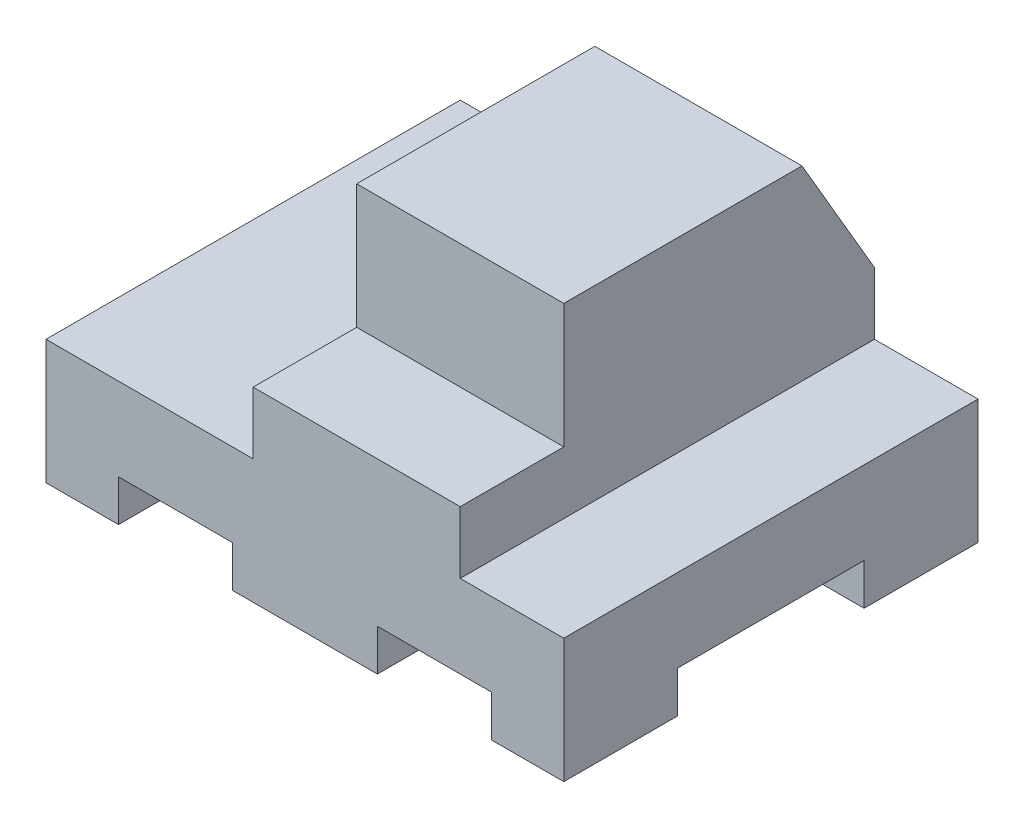
ISO-10303-21;
HEADER;
FILE_DESCRIPTION(('STEP AP214'),'2;1');
FILE_NAME('part.step','',(''),(''),'','','');
FILE_SCHEMA(('AUTOMOTIVE_DESIGN { 1 0 10303 214 1 1 1 1 }'));
ENDSEC;
DATA;
#1=APPLICATION_CONTEXT('core data for automotive mechanical design processes');
#2=APPLICATION_PROTOCOL_DEFINITION('international standard','automotive_design',2000,#1);
#3=PRODUCT_CONTEXT('',#1,'mechanical');
#4=PRODUCT('Part','Part','',(#3));
#5=PRODUCT_RELATED_PRODUCT_CATEGORY('part','',(#4));
#6=PRODUCT_DEFINITION_FORMATION('','',#4);
#7=PRODUCT_DEFINITION_CONTEXT('part definition',#1,'design');
#8=PRODUCT_DEFINITION('design','',#6,#7);
#9=PRODUCT_DEFINITION_SHAPE('','',#8);
#10=(LENGTH_UNIT() NAMED_UNIT(*) SI_UNIT(.MILLI.,.METRE.));
#11=(NAMED_UNIT(*) PLANE_ANGLE_UNIT() SI_UNIT($,.RADIAN.));
#12=(NAMED_UNIT(*) SI_UNIT($,.STERADIAN.) SOLID_ANGLE_UNIT());
#13=UNCERTAINTY_MEASURE_WITH_UNIT(LENGTH_MEASURE(1.E-05),#10,'distance_accuracy_value','');
#14=(GEOMETRIC_REPRESENTATION_CONTEXT(3) GLOBAL_UNCERTAINTY_ASSIGNED_CONTEXT((#13)) GLOBAL_UNIT_ASSIGNED_CONTEXT((#10,
#11,#12)) REPRESENTATION_CONTEXT('',''));
#15=CARTESIAN_POINT('',(0.,0.,0.));
#16=DIRECTION('',(0.,0.,1.));
#17=DIRECTION('',(1.,0.,0.));
#18=AXIS2_PLACEMENT_3D('',#15,#16,#17);
#19=CARTESIAN_POINT('',(0.,0.,40.));
#20=DIRECTION('',(0.,0.,1.));
#21=DIRECTION('',(1.,0.,0.));
#22=AXIS2_PLACEMENT_3D('',#19,#20,#21);
#23=PLANE('',#22);
#24=DIRECTION('',(1.,0.,0.));
#25=VECTOR('',#24,1.);
#26=CARTESIAN_POINT('',(-25.,2.99999999999999,40.));
#27=LINE('',#26,#25);
#28=CARTESIAN_POINT('',(-4.99999999999999,3.,40.));
#29=VERTEX_POINT('',#28);
#30=CARTESIAN_POINT('',(15.,3.,40.));
#31=VERTEX_POINT('',#30);
#32=EDGE_CURVE('E278',#29,#31,#27,.T.);
#33=ORIENTED_EDGE('',*,*,#32,.F.);
#34=DIRECTION('',(0.,1.,0.));
#35=VECTOR('',#34,1.);
#36=CARTESIAN_POINT('',(-4.99999999999999,0.,40.));
#37=LINE('',#36,#35);
#38=CARTESIAN_POINT('',(-4.99999999999999,-3.,40.));
#39=VERTEX_POINT('',#38);
#40=EDGE_CURVE('E275',#39,#29,#37,.T.);
#41=ORIENTED_EDGE('',*,*,#40,.F.);
#42=DIRECTION('',(1.,0.,0.));
#43=VECTOR('',#42,1.);
#44=CARTESIAN_POINT('',(0.,-3.,40.));
#45=LINE('',#44,#43);
#46=CARTESIAN_POINT('',(-25.,-3.,40.));
#47=VERTEX_POINT('',#46);
#48=EDGE_CURVE('E420',#47,#39,#45,.T.);
#49=ORIENTED_EDGE('',*,*,#48,.F.);
#50=DIRECTION('',(0.,1.,0.));
#51=VECTOR('',#50,1.);
#52=CARTESIAN_POINT('',(-25.,0.,40.));
#53=LINE('',#52,#51);
#54=CARTESIAN_POINT('',(-25.,-15.,40.));
#55=VERTEX_POINT('',#54);
#56=EDGE_CURVE('E422',#55,#47,#53,.T.);
#57=ORIENTED_EDGE('',*,*,#56,.F.);
#58=DIRECTION('',(1.,0.,0.));
#59=VECTOR('',#58,1.);
#60=CARTESIAN_POINT('',(0.,-15.,40.));
#61=LINE('',#60,#59);
#62=CARTESIAN_POINT('',(-18.,-15.,40.));
#63=VERTEX_POINT('',#62);
#64=EDGE_CURVE('E426',#55,#63,#61,.T.);
#65=ORIENTED_EDGE('',*,*,#64,.T.);
#66=DIRECTION('',(0.,1.,0.));
#67=VECTOR('',#66,1.);
#68=CARTESIAN_POINT('',(-18.,0.,40.));
#69=LINE('',#68,#67);
#70=CARTESIAN_POINT('',(-18.,-11.,40.));
#71=VERTEX_POINT('',#70);
#72=EDGE_CURVE('E339',#63,#71,#69,.T.);
#73=ORIENTED_EDGE('',*,*,#72,.T.);
#74=DIRECTION('',(1.,0.,0.));
#75=VECTOR('',#74,1.);
#76=CARTESIAN_POINT('',(0.,-11.,40.));
#77=LINE('',#76,#75);
#78=CARTESIAN_POINT('',(-7.,-11.,40.));
#79=VERTEX_POINT('',#78);
#80=EDGE_CURVE('E346',#71,#79,#77,.T.);
#81=ORIENTED_EDGE('',*,*,#80,.T.);
#82=DIRECTION('',(0.,1.,0.));
#83=VECTOR('',#82,1.);
#84=CARTESIAN_POINT('',(-7.,0.,40.));
#85=LINE('',#84,#83);
#86=CARTESIAN_POINT('',(-7.,-15.,40.));
#87=VERTEX_POINT('',#86);
#88=EDGE_CURVE('E334',#87,#79,#85,.T.);
#89=ORIENTED_EDGE('',*,*,#88,.F.);
#90=CARTESIAN_POINT('',(7.,-15.,40.));
#91=VERTEX_POINT('',#90);
#92=EDGE_CURVE('E430',#87,#91,#61,.T.);
#93=ORIENTED_EDGE('',*,*,#92,.T.);
#94=DIRECTION('',(0.,1.,0.));
#95=VECTOR('',#94,1.);
#96=CARTESIAN_POINT('',(7.,0.,40.));
#97=LINE('',#96,#95);
#98=CARTESIAN_POINT('',(7.,-11.,40.));
#99=VERTEX_POINT('',#98);
#100=EDGE_CURVE('E297',#91,#99,#97,.T.);
#101=ORIENTED_EDGE('',*,*,#100,.T.);
#102=DIRECTION('',(-1.,0.,0.));
#103=VECTOR('',#102,1.);
#104=CARTESIAN_POINT('',(0.,-11.,40.));
#105=LINE('',#104,#103);
#106=CARTESIAN_POINT('',(18.,-11.,40.));
#107=VERTEX_POINT('',#106);
#108=EDGE_CURVE('E306',#107,#99,#105,.T.);
#109=ORIENTED_EDGE('',*,*,#108,.F.);
#110=DIRECTION('',(0.,1.,0.));
#111=VECTOR('',#110,1.);
#112=CARTESIAN_POINT('',(18.,0.,40.));
#113=LINE('',#112,#111);
#114=CARTESIAN_POINT('',(18.,-15.,40.));
#115=VERTEX_POINT('',#114);
#116=EDGE_CURVE('E303',#115,#107,#113,.T.);
#117=ORIENTED_EDGE('',*,*,#116,.F.);
#118=CARTESIAN_POINT('',(25.,-15.,40.));
#119=VERTEX_POINT('',#118);
#120=EDGE_CURVE('E425',#115,#119,#61,.T.);
#121=ORIENTED_EDGE('',*,*,#120,.T.);
#122=DIRECTION('',(0.,1.,0.));
#123=VECTOR('',#122,1.);
#124=CARTESIAN_POINT('',(25.,0.,40.));
#125=LINE('',#124,#123);
#126=CARTESIAN_POINT('',(25.,-3.,40.));
#127=VERTEX_POINT('',#126);
#128=EDGE_CURVE('E429',#119,#127,#125,.T.);
#129=ORIENTED_EDGE('',*,*,#128,.T.);
#130=DIRECTION('',(1.,0.,0.));
#131=VECTOR('',#130,1.);
#132=CARTESIAN_POINT('',(0.,-3.,40.));
#133=LINE('',#132,#131);
#134=CARTESIAN_POINT('',(15.,-3.,40.));
#135=VERTEX_POINT('',#134);
#136=EDGE_CURVE('E414',#135,#127,#133,.T.);
#137=ORIENTED_EDGE('',*,*,#136,.F.);
#138=DIRECTION('',(0.,-1.,0.));
#139=VECTOR('',#138,1.);
#140=CARTESIAN_POINT('',(15.,0.,40.));
#141=LINE('',#140,#139);
#142=EDGE_CURVE('E285',#31,#135,#141,.T.);
#143=ORIENTED_EDGE('',*,*,#142,.F.);
#144=EDGE_LOOP('',(#33,#41,#49,#57,#65,#73,#81,#89,#93,#101,#109,#117,#121,#129,#137,#143));
#145=FACE_BOUND('',#144,.T.);
#146=ADVANCED_FACE('F37',(#145),#23,.T.);
#147=CARTESIAN_POINT('',(0.,0.,0.));
#148=DIRECTION('',(0.,0.,1.));
#149=DIRECTION('',(1.,0.,0.));
#150=AXIS2_PLACEMENT_3D('',#147,#148,#149);
#151=PLANE('',#150);
#152=DIRECTION('',(0.,1.,0.));
#153=VECTOR('',#152,1.);
#154=CARTESIAN_POINT('',(-4.99999999999999,0.,0.));
#155=LINE('',#154,#153);
#156=CARTESIAN_POINT('',(-4.99999999999999,-3.,0.));
#157=VERTEX_POINT('',#156);
#158=CARTESIAN_POINT('',(-4.99999999999999,2.99999999999998,0.));
#159=VERTEX_POINT('',#158);
#160=EDGE_CURVE('E436',#157,#159,#155,.T.);
#161=ORIENTED_EDGE('',*,*,#160,.T.);
#162=DIRECTION('',(1.,0.,0.));
#163=VECTOR('',#162,1.);
#164=CARTESIAN_POINT('',(-25.,2.99999999999999,0.));
#165=LINE('',#164,#163);
#166=CARTESIAN_POINT('',(15.,3.,0.));
#167=VERTEX_POINT('',#166);
#168=EDGE_CURVE('E51',#159,#167,#165,.T.);
#169=ORIENTED_EDGE('',*,*,#168,.T.);
#170=DIRECTION('',(0.,-1.,0.));
#171=VECTOR('',#170,1.);
#172=CARTESIAN_POINT('',(15.,0.,0.));
#173=LINE('',#172,#171);
#174=CARTESIAN_POINT('',(15.,-3.,0.));
#175=VERTEX_POINT('',#174);
#176=EDGE_CURVE('E253',#167,#175,#173,.T.);
#177=ORIENTED_EDGE('',*,*,#176,.T.);
#178=DIRECTION('',(1.,0.,0.));
#179=VECTOR('',#178,1.);
#180=CARTESIAN_POINT('',(0.,-3.,0.));
#181=LINE('',#180,#179);
#182=CARTESIAN_POINT('',(25.,-3.,0.));
#183=VERTEX_POINT('',#182);
#184=EDGE_CURVE('E397',#175,#183,#181,.T.);
#185=ORIENTED_EDGE('',*,*,#184,.T.);
#186=DIRECTION('',(0.,1.,0.));
#187=VECTOR('',#186,1.);
#188=CARTESIAN_POINT('',(25.,0.,0.));
#189=LINE('',#188,#187);
#190=CARTESIAN_POINT('',(25.,-15.,0.));
#191=VERTEX_POINT('',#190);
#192=EDGE_CURVE('E417',#191,#183,#189,.T.);
#193=ORIENTED_EDGE('',*,*,#192,.F.);
#194=DIRECTION('',(1.,0.,0.));
#195=VECTOR('',#194,1.);
#196=CARTESIAN_POINT('',(0.,-15.,0.));
#197=LINE('',#196,#195);
#198=CARTESIAN_POINT('',(18.,-15.,0.));
#199=VERTEX_POINT('',#198);
#200=EDGE_CURVE('E445',#199,#191,#197,.T.);
#201=ORIENTED_EDGE('',*,*,#200,.F.);
#202=DIRECTION('',(0.,1.,0.));
#203=VECTOR('',#202,1.);
#204=CARTESIAN_POINT('',(18.,0.,0.));
#205=LINE('',#204,#203);
#206=CARTESIAN_POINT('',(18.,-11.,0.));
#207=VERTEX_POINT('',#206);
#208=EDGE_CURVE('E293',#199,#207,#205,.T.);
#209=ORIENTED_EDGE('',*,*,#208,.T.);
#210=DIRECTION('',(-1.,0.,0.));
#211=VECTOR('',#210,1.);
#212=CARTESIAN_POINT('',(0.,-11.,0.));
#213=LINE('',#212,#211);
#214=CARTESIAN_POINT('',(7.,-11.,0.));
#215=VERTEX_POINT('',#214);
#216=EDGE_CURVE('E296',#207,#215,#213,.T.);
#217=ORIENTED_EDGE('',*,*,#216,.T.);
#218=DIRECTION('',(0.,1.,0.));
#219=VECTOR('',#218,1.);
#220=CARTESIAN_POINT('',(7.,0.,0.));
#221=LINE('',#220,#219);
#222=CARTESIAN_POINT('',(7.,-15.,0.));
#223=VERTEX_POINT('',#222);
#224=EDGE_CURVE('E300',#223,#215,#221,.T.);
#225=ORIENTED_EDGE('',*,*,#224,.F.);
#226=CARTESIAN_POINT('',(-7.,-15.,0.));
#227=VERTEX_POINT('',#226);
#228=EDGE_CURVE('E449',#227,#223,#197,.T.);
#229=ORIENTED_EDGE('',*,*,#228,.F.);
#230=DIRECTION('',(0.,1.,0.));
#231=VECTOR('',#230,1.);
#232=CARTESIAN_POINT('',(-7.,0.,0.));
#233=LINE('',#232,#231);
#234=CARTESIAN_POINT('',(-7.,-11.,0.));
#235=VERTEX_POINT('',#234);
#236=EDGE_CURVE('E335',#227,#235,#233,.T.);
#237=ORIENTED_EDGE('',*,*,#236,.T.);
#238=DIRECTION('',(1.,0.,0.));
#239=VECTOR('',#238,1.);
#240=CARTESIAN_POINT('',(0.,-11.,0.));
#241=LINE('',#240,#239);
#242=CARTESIAN_POINT('',(-18.,-11.,0.));
#243=VERTEX_POINT('',#242);
#244=EDGE_CURVE('E338',#243,#235,#241,.T.);
#245=ORIENTED_EDGE('',*,*,#244,.F.);
#246=DIRECTION('',(0.,1.,0.));
#247=VECTOR('',#246,1.);
#248=CARTESIAN_POINT('',(-18.,0.,0.));
#249=LINE('',#248,#247);
#250=CARTESIAN_POINT('',(-18.,-15.,0.));
#251=VERTEX_POINT('',#250);
#252=EDGE_CURVE('E341',#251,#243,#249,.T.);
#253=ORIENTED_EDGE('',*,*,#252,.F.);
#254=CARTESIAN_POINT('',(-25.,-15.,0.));
#255=VERTEX_POINT('',#254);
#256=EDGE_CURVE('E446',#255,#251,#197,.T.);
#257=ORIENTED_EDGE('',*,*,#256,.F.);
#258=DIRECTION('',(0.,1.,0.));
#259=VECTOR('',#258,1.);
#260=CARTESIAN_POINT('',(-25.,0.,0.));
#261=LINE('',#260,#259);
#262=CARTESIAN_POINT('',(-25.,-3.,0.));
#263=VERTEX_POINT('',#262);
#264=EDGE_CURVE('E442',#255,#263,#261,.T.);
#265=ORIENTED_EDGE('',*,*,#264,.T.);
#266=DIRECTION('',(1.,0.,0.));
#267=VECTOR('',#266,1.);
#268=CARTESIAN_POINT('',(0.,-3.,0.));
#269=LINE('',#268,#267);
#270=EDGE_CURVE('E439',#263,#157,#269,.T.);
#271=ORIENTED_EDGE('',*,*,#270,.T.);
#272=EDGE_LOOP('',(#161,#169,#177,#185,#193,#201,#209,#217,#225,#229,#237,#245,#253,#257,#265,#271));
#273=FACE_BOUND('',#272,.T.);
#274=ADVANCED_FACE('F467',(#273),#151,.F.);
#275=CARTESIAN_POINT('',(0.,-15.,40.));
#276=DIRECTION('',(0.,1.,0.));
#277=DIRECTION('',(0.,0.,1.));
#278=AXIS2_PLACEMENT_3D('',#275,#276,#277);
#279=PLANE('',#278);
#280=DIRECTION('',(0.,0.,1.));
#281=VECTOR('',#280,1.);
#282=CARTESIAN_POINT('',(7.,-15.,0.));
#283=LINE('',#282,#281);
#284=CARTESIAN_POINT('',(7.,-15.,29.));
#285=VERTEX_POINT('',#284);
#286=EDGE_CURVE('E315',#285,#91,#283,.T.);
#287=ORIENTED_EDGE('',*,*,#286,.T.);
#288=ORIENTED_EDGE('',*,*,#92,.F.);
#289=DIRECTION('',(0.,0.,1.));
#290=VECTOR('',#289,1.);
#291=CARTESIAN_POINT('',(-7.,-15.,0.));
#292=LINE('',#291,#290);
#293=CARTESIAN_POINT('',(-7.,-15.,29.));
#294=VERTEX_POINT('',#293);
#295=EDGE_CURVE('E343',#294,#87,#292,.T.);
#296=ORIENTED_EDGE('',*,*,#295,.F.);
#297=DIRECTION('',(-1.,0.,0.));
#298=VECTOR('',#297,1.);
#299=CARTESIAN_POINT('',(25.,-15.,29.));
#300=LINE('',#299,#298);
#301=EDGE_CURVE('E398',#285,#294,#300,.T.);
#302=ORIENTED_EDGE('',*,*,#301,.F.);
#303=EDGE_LOOP('',(#287,#288,#296,#302));
#304=FACE_BOUND('',#303,.T.);
#305=ADVANCED_FACE('F507',(#304),#279,.F.);
#306=CARTESIAN_POINT('',(7.,-15.,11.));
#307=VERTEX_POINT('',#306);
#308=EDGE_CURVE('E311',#223,#307,#283,.T.);
#309=ORIENTED_EDGE('',*,*,#308,.T.);
#310=DIRECTION('',(-1.,0.,0.));
#311=VECTOR('',#310,1.);
#312=CARTESIAN_POINT('',(25.,-15.,11.));
#313=LINE('',#312,#311);
#314=CARTESIAN_POINT('',(-7.,-15.,11.));
#315=VERTEX_POINT('',#314);
#316=EDGE_CURVE('E403',#307,#315,#313,.T.);
#317=ORIENTED_EDGE('',*,*,#316,.T.);
#318=EDGE_CURVE('E363',#227,#315,#292,.T.);
#319=ORIENTED_EDGE('',*,*,#318,.F.);
#320=ORIENTED_EDGE('',*,*,#228,.T.);
#321=EDGE_LOOP('',(#309,#317,#319,#320));
#322=FACE_BOUND('',#321,.T.);
#323=ADVANCED_FACE('F537',(#322),#279,.F.);
#324=CARTESIAN_POINT('',(25.,-15.,29.));
#325=DIRECTION('',(0.,0.,1.));
#326=DIRECTION('',(1.,0.,0.));
#327=AXIS2_PLACEMENT_3D('',#324,#325,#326);
#328=PLANE('',#327);
#329=DIRECTION('',(0.,1.,0.));
#330=VECTOR('',#329,1.);
#331=CARTESIAN_POINT('',(7.,-15.,29.));
#332=LINE('',#331,#330);
#333=CARTESIAN_POINT('',(7.,-11.,29.));
#334=VERTEX_POINT('',#333);
#335=EDGE_CURVE('E332',#285,#334,#332,.T.);
#336=ORIENTED_EDGE('',*,*,#335,.F.);
#337=ORIENTED_EDGE('',*,*,#301,.T.);
#338=DIRECTION('',(0.,1.,0.));
#339=VECTOR('',#338,1.);
#340=CARTESIAN_POINT('',(-7.,-15.,29.));
#341=LINE('',#340,#339);
#342=CARTESIAN_POINT('',(-7.,-11.,29.));
#343=VERTEX_POINT('',#342);
#344=EDGE_CURVE('E368',#294,#343,#341,.T.);
#345=ORIENTED_EDGE('',*,*,#344,.T.);
#346=DIRECTION('',(-1.,0.,0.));
#347=VECTOR('',#346,1.);
#348=CARTESIAN_POINT('',(25.,-11.,29.));
#349=LINE('',#348,#347);
#350=EDGE_CURVE('E413',#334,#343,#349,.T.);
#351=ORIENTED_EDGE('',*,*,#350,.F.);
#352=EDGE_LOOP('',(#336,#337,#345,#351));
#353=FACE_BOUND('',#352,.T.);
#354=ADVANCED_FACE('F503',(#353),#328,.F.);
#355=CARTESIAN_POINT('',(25.,-15.,11.));
#356=DIRECTION('',(0.,0.,-1.));
#357=DIRECTION('',(-1.,0.,0.));
#358=AXIS2_PLACEMENT_3D('',#355,#356,#357);
#359=PLANE('',#358);
#360=DIRECTION('',(0.,-1.,0.));
#361=VECTOR('',#360,1.);
#362=CARTESIAN_POINT('',(7.,-15.,11.));
#363=LINE('',#362,#361);
#364=CARTESIAN_POINT('',(7.,-11.,11.));
#365=VERTEX_POINT('',#364);
#366=EDGE_CURVE('E330',#365,#307,#363,.T.);
#367=ORIENTED_EDGE('',*,*,#366,.F.);
#368=DIRECTION('',(-1.,0.,0.));
#369=VECTOR('',#368,1.);
#370=CARTESIAN_POINT('',(25.,-11.,11.));
#371=LINE('',#370,#369);
#372=CARTESIAN_POINT('',(-7.,-11.,11.));
#373=VERTEX_POINT('',#372);
#374=EDGE_CURVE('E408',#365,#373,#371,.T.);
#375=ORIENTED_EDGE('',*,*,#374,.T.);
#376=DIRECTION('',(0.,-1.,0.));
#377=VECTOR('',#376,1.);
#378=CARTESIAN_POINT('',(-7.,-15.,11.));
#379=LINE('',#378,#377);
#380=EDGE_CURVE('E354',#373,#315,#379,.T.);
#381=ORIENTED_EDGE('',*,*,#380,.T.);
#382=ORIENTED_EDGE('',*,*,#316,.F.);
#383=EDGE_LOOP('',(#367,#375,#381,#382));
#384=FACE_BOUND('',#383,.T.);
#385=ADVANCED_FACE('F561',(#384),#359,.F.);
#386=DIRECTION('',(0.,0.,1.));
#387=VECTOR('',#386,1.);
#388=CARTESIAN_POINT('',(-18.,-15.,0.));
#389=LINE('',#388,#387);
#390=CARTESIAN_POINT('',(-18.,-15.,29.));
#391=VERTEX_POINT('',#390);
#392=EDGE_CURVE('E355',#391,#63,#389,.T.);
#393=ORIENTED_EDGE('',*,*,#392,.T.);
#394=ORIENTED_EDGE('',*,*,#64,.F.);
#395=DIRECTION('',(0.,0.,-1.));
#396=VECTOR('',#395,1.);
#397=CARTESIAN_POINT('',(-25.,-15.,40.));
#398=LINE('',#397,#396);
#399=CARTESIAN_POINT('',(-25.,-15.,29.));
#400=VERTEX_POINT('',#399);
#401=EDGE_CURVE('E458',#55,#400,#398,.T.);
#402=ORIENTED_EDGE('',*,*,#401,.T.);
#403=EDGE_CURVE('E399',#391,#400,#300,.T.);
#404=ORIENTED_EDGE('',*,*,#403,.F.);
#405=EDGE_LOOP('',(#393,#394,#402,#404));
#406=FACE_BOUND('',#405,.T.);
#407=ADVANCED_FACE('F480',(#406),#279,.F.);
#408=CARTESIAN_POINT('',(-18.,-15.,11.));
#409=VERTEX_POINT('',#408);
#410=EDGE_CURVE('E351',#251,#409,#389,.T.);
#411=ORIENTED_EDGE('',*,*,#410,.T.);
#412=CARTESIAN_POINT('',(-25.,-15.,11.));
#413=VERTEX_POINT('',#412);
#414=EDGE_CURVE('E404',#409,#413,#313,.T.);
#415=ORIENTED_EDGE('',*,*,#414,.T.);
#416=EDGE_CURVE('E457',#413,#255,#398,.T.);
#417=ORIENTED_EDGE('',*,*,#416,.T.);
#418=ORIENTED_EDGE('',*,*,#256,.T.);
#419=EDGE_LOOP('',(#411,#415,#417,#418));
#420=FACE_BOUND('',#419,.T.);
#421=ADVANCED_FACE('F558',(#420),#279,.F.);
#422=DIRECTION('',(0.,1.,0.));
#423=VECTOR('',#422,1.);
#424=CARTESIAN_POINT('',(-18.,-15.,29.));
#425=LINE('',#424,#423);
#426=CARTESIAN_POINT('',(-18.,-11.,29.));
#427=VERTEX_POINT('',#426);
#428=EDGE_CURVE('E373',#391,#427,#425,.T.);
#429=ORIENTED_EDGE('',*,*,#428,.F.);
#430=ORIENTED_EDGE('',*,*,#403,.T.);
#431=DIRECTION('',(0.,1.,0.));
#432=VECTOR('',#431,1.);
#433=CARTESIAN_POINT('',(-25.,-15.,29.));
#434=LINE('',#433,#432);
#435=CARTESIAN_POINT('',(-25.,-11.,29.));
#436=VERTEX_POINT('',#435);
#437=EDGE_CURVE('E375',#400,#436,#434,.T.);
#438=ORIENTED_EDGE('',*,*,#437,.T.);
#439=EDGE_CURVE('E386',#427,#436,#349,.T.);
#440=ORIENTED_EDGE('',*,*,#439,.F.);
#441=EDGE_LOOP('',(#429,#430,#438,#440));
#442=FACE_BOUND('',#441,.T.);
#443=ADVANCED_FACE('F488',(#442),#328,.F.);
#444=DIRECTION('',(0.,-1.,0.));
#445=VECTOR('',#444,1.);
#446=CARTESIAN_POINT('',(-18.,-15.,11.));
#447=LINE('',#446,#445);
#448=CARTESIAN_POINT('',(-18.,-11.,11.));
#449=VERTEX_POINT('',#448);
#450=EDGE_CURVE('E371',#449,#409,#447,.T.);
#451=ORIENTED_EDGE('',*,*,#450,.F.);
#452=CARTESIAN_POINT('',(-25.,-11.,11.));
#453=VERTEX_POINT('',#452);
#454=EDGE_CURVE('E409',#449,#453,#371,.T.);
#455=ORIENTED_EDGE('',*,*,#454,.T.);
#456=DIRECTION('',(0.,-1.,0.));
#457=VECTOR('',#456,1.);
#458=CARTESIAN_POINT('',(-25.,-15.,11.));
#459=LINE('',#458,#457);
#460=EDGE_CURVE('E380',#453,#413,#459,.T.);
#461=ORIENTED_EDGE('',*,*,#460,.T.);
#462=ORIENTED_EDGE('',*,*,#414,.F.);
#463=EDGE_LOOP('',(#451,#455,#461,#462));
#464=FACE_BOUND('',#463,.T.);
#465=ADVANCED_FACE('F553',(#464),#359,.F.);
#466=ORIENTED_EDGE('',*,*,#120,.F.);
#467=DIRECTION('',(0.,0.,1.));
#468=VECTOR('',#467,1.);
#469=CARTESIAN_POINT('',(18.,-15.,0.));
#470=LINE('',#469,#468);
#471=CARTESIAN_POINT('',(18.,-15.,29.));
#472=VERTEX_POINT('',#471);
#473=EDGE_CURVE('E302',#472,#115,#470,.T.);
#474=ORIENTED_EDGE('',*,*,#473,.F.);
#475=CARTESIAN_POINT('',(25.,-15.,29.));
#476=VERTEX_POINT('',#475);
#477=EDGE_CURVE('E394',#476,#472,#300,.T.);
#478=ORIENTED_EDGE('',*,*,#477,.F.);
#479=DIRECTION('',(0.,0.,-1.));
#480=VECTOR('',#479,1.);
#481=CARTESIAN_POINT('',(25.,-15.,40.));
#482=LINE('',#481,#480);
#483=EDGE_CURVE('E454',#119,#476,#482,.T.);
#484=ORIENTED_EDGE('',*,*,#483,.F.);
#485=EDGE_LOOP('',(#466,#474,#478,#484));
#486=FACE_BOUND('',#485,.T.);
#487=ADVANCED_FACE('F519',(#486),#279,.F.);
#488=CARTESIAN_POINT('',(0.,-3.,40.));
#489=DIRECTION('',(0.,1.,0.));
#490=DIRECTION('',(0.,0.,1.));
#491=AXIS2_PLACEMENT_3D('',#488,#489,#490);
#492=PLANE('',#491);
#493=ORIENTED_EDGE('',*,*,#184,.F.);
#494=DIRECTION('',(0.,0.,-1.));
#495=VECTOR('',#494,1.);
#496=CARTESIAN_POINT('',(15.,-3.,40.));
#497=LINE('',#496,#495);
#498=EDGE_CURVE('E258',#135,#175,#497,.T.);
#499=ORIENTED_EDGE('',*,*,#498,.F.);
#500=ORIENTED_EDGE('',*,*,#136,.T.);
#501=DIRECTION('',(0.,0.,-1.));
#502=VECTOR('',#501,1.);
#503=CARTESIAN_POINT('',(25.,-3.,40.));
#504=LINE('',#503,#502);
#505=EDGE_CURVE('E432',#127,#183,#504,.T.);
#506=ORIENTED_EDGE('',*,*,#505,.T.);
#507=EDGE_LOOP('',(#493,#499,#500,#506));
#508=FACE_BOUND('',#507,.T.);
#509=ADVANCED_FACE('F39',(#508),#492,.T.);
#510=CARTESIAN_POINT('',(15.,0.,40.));
#511=DIRECTION('',(1.,0.,0.));
#512=DIRECTION('',(0.,1.,0.));
#513=AXIS2_PLACEMENT_3D('',#510,#511,#512);
#514=PLANE('',#513);
#515=DIRECTION('',(0.,-0.863778900898433,-0.503871025524086));
#516=VECTOR('',#515,1.);
#517=CARTESIAN_POINT('',(15.,15.,7.));
#518=LINE('',#517,#516);
#519=CARTESIAN_POINT('',(15.,15.,7.));
#520=VERTEX_POINT('',#519);
#521=EDGE_CURVE('E240',#520,#167,#518,.T.);
#522=ORIENTED_EDGE('',*,*,#521,.F.);
#523=DIRECTION('',(0.,0.,-1.));
#524=VECTOR('',#523,1.);
#525=CARTESIAN_POINT('',(15.,15.,40.));
#526=LINE('',#525,#524);
#527=CARTESIAN_POINT('',(15.,15.,30.));
#528=VERTEX_POINT('',#527);
#529=EDGE_CURVE('E251',#528,#520,#526,.T.);
#530=ORIENTED_EDGE('',*,*,#529,.F.);
#531=DIRECTION('',(0.,1.,0.));
#532=VECTOR('',#531,1.);
#533=CARTESIAN_POINT('',(15.,15.,30.));
#534=LINE('',#533,#532);
#535=CARTESIAN_POINT('',(15.,3.,30.));
#536=VERTEX_POINT('',#535);
#537=EDGE_CURVE('E286',#536,#528,#534,.T.);
#538=ORIENTED_EDGE('',*,*,#537,.F.);
#539=DIRECTION('',(0.,0.,-1.));
#540=VECTOR('',#539,1.);
#541=CARTESIAN_POINT('',(15.,3.,40.));
#542=LINE('',#541,#540);
#543=EDGE_CURVE('E289',#31,#536,#542,.T.);
#544=ORIENTED_EDGE('',*,*,#543,.F.);
#545=ORIENTED_EDGE('',*,*,#142,.T.);
#546=ORIENTED_EDGE('',*,*,#498,.T.);
#547=ORIENTED_EDGE('',*,*,#176,.F.);
#548=EDGE_LOOP('',(#522,#530,#538,#544,#545,#546,#547));
#549=FACE_BOUND('',#548,.T.);
#550=ADVANCED_FACE('F249',(#549),#514,.T.);
#551=CARTESIAN_POINT('',(0.,15.,40.));
#552=DIRECTION('',(0.,1.,0.));
#553=DIRECTION('',(0.,0.,1.));
#554=AXIS2_PLACEMENT_3D('',#551,#552,#553);
#555=PLANE('',#554);
#556=DIRECTION('',(1.,0.,0.));
#557=VECTOR('',#556,1.);
#558=CARTESIAN_POINT('',(-25.,15.,7.));
#559=LINE('',#558,#557);
#560=CARTESIAN_POINT('',(-4.99999999999999,15.,7.));
#561=VERTEX_POINT('',#560);
#562=EDGE_CURVE('E237',#561,#520,#559,.T.);
#563=ORIENTED_EDGE('',*,*,#562,.F.);
#564=DIRECTION('',(0.,0.,-1.));
#565=VECTOR('',#564,1.);
#566=CARTESIAN_POINT('',(-4.99999999999999,15.,40.));
#567=LINE('',#566,#565);
#568=CARTESIAN_POINT('',(-4.99999999999999,15.,30.));
#569=VERTEX_POINT('',#568);
#570=EDGE_CURVE('E259',#569,#561,#567,.T.);
#571=ORIENTED_EDGE('',*,*,#570,.F.);
#572=DIRECTION('',(1.,0.,0.));
#573=VECTOR('',#572,1.);
#574=CARTESIAN_POINT('',(-25.,15.,30.));
#575=LINE('',#574,#573);
#576=EDGE_CURVE('E257',#569,#528,#575,.T.);
#577=ORIENTED_EDGE('',*,*,#576,.T.);
#578=ORIENTED_EDGE('',*,*,#529,.T.);
#579=EDGE_LOOP('',(#563,#571,#577,#578));
#580=FACE_BOUND('',#579,.T.);
#581=ADVANCED_FACE('F256',(#580),#555,.T.);
#582=CARTESIAN_POINT('',(-4.99999999999999,0.,40.));
#583=DIRECTION('',(-1.,0.,0.));
#584=DIRECTION('',(0.,0.,1.));
#585=AXIS2_PLACEMENT_3D('',#582,#583,#584);
#586=PLANE('',#585);
#587=DIRECTION('',(0.,0.863778900898434,0.503871025524086));
#588=VECTOR('',#587,1.);
#589=CARTESIAN_POINT('',(-4.99999999999999,18.1709844559585,8.84974093264249));
#590=LINE('',#589,#588);
#591=EDGE_CURVE('E11',#159,#561,#590,.T.);
#592=ORIENTED_EDGE('',*,*,#591,.F.);
#593=ORIENTED_EDGE('',*,*,#160,.F.);
#594=DIRECTION('',(0.,0.,-1.));
#595=VECTOR('',#594,1.);
#596=CARTESIAN_POINT('',(-4.99999999999999,-3.,40.));
#597=LINE('',#596,#595);
#598=EDGE_CURVE('E263',#39,#157,#597,.T.);
#599=ORIENTED_EDGE('',*,*,#598,.F.);
#600=ORIENTED_EDGE('',*,*,#40,.T.);
#601=DIRECTION('',(0.,0.,1.));
#602=VECTOR('',#601,1.);
#603=CARTESIAN_POINT('',(-4.99999999999999,3.,40.));
#604=LINE('',#603,#602);
#605=CARTESIAN_POINT('',(-4.99999999999999,3.,30.));
#606=VERTEX_POINT('',#605);
#607=EDGE_CURVE('E261',#606,#29,#604,.T.);
#608=ORIENTED_EDGE('',*,*,#607,.F.);
#609=DIRECTION('',(0.,-1.,0.));
#610=VECTOR('',#609,1.);
#611=CARTESIAN_POINT('',(-4.99999999999999,0.,30.));
#612=LINE('',#611,#610);
#613=EDGE_CURVE('E45',#569,#606,#612,.T.);
#614=ORIENTED_EDGE('',*,*,#613,.F.);
#615=ORIENTED_EDGE('',*,*,#570,.T.);
#616=EDGE_LOOP('',(#592,#593,#599,#600,#608,#614,#615));
#617=FACE_BOUND('',#616,.T.);
#618=ADVANCED_FACE('F273',(#617),#586,.T.);
#619=CARTESIAN_POINT('',(0.,-3.,40.));
#620=DIRECTION('',(0.,1.,0.));
#621=DIRECTION('',(0.,0.,1.));
#622=AXIS2_PLACEMENT_3D('',#619,#620,#621);
#623=PLANE('',#622);
#624=ORIENTED_EDGE('',*,*,#270,.F.);
#625=DIRECTION('',(0.,0.,-1.));
#626=VECTOR('',#625,1.);
#627=CARTESIAN_POINT('',(-25.,-3.,40.));
#628=LINE('',#627,#626);
#629=EDGE_CURVE('E461',#47,#263,#628,.T.);
#630=ORIENTED_EDGE('',*,*,#629,.F.);
#631=ORIENTED_EDGE('',*,*,#48,.T.);
#632=ORIENTED_EDGE('',*,*,#598,.T.);
#633=EDGE_LOOP('',(#624,#630,#631,#632));
#634=FACE_BOUND('',#633,.T.);
#635=ADVANCED_FACE('F465',(#634),#623,.T.);
#636=CARTESIAN_POINT('',(-25.,0.,40.));
#637=DIRECTION('',(-1.,0.,0.));
#638=DIRECTION('',(0.,0.,1.));
#639=AXIS2_PLACEMENT_3D('',#636,#637,#638);
#640=PLANE('',#639);
#641=ORIENTED_EDGE('',*,*,#437,.F.);
#642=ORIENTED_EDGE('',*,*,#401,.F.);
#643=ORIENTED_EDGE('',*,*,#56,.T.);
#644=ORIENTED_EDGE('',*,*,#629,.T.);
#645=ORIENTED_EDGE('',*,*,#264,.F.);
#646=ORIENTED_EDGE('',*,*,#416,.F.);
#647=ORIENTED_EDGE('',*,*,#460,.F.);
#648=DIRECTION('',(0.,0.,-1.));
#649=VECTOR('',#648,1.);
#650=CARTESIAN_POINT('',(-25.,-11.,11.));
#651=LINE('',#650,#649);
#652=EDGE_CURVE('E389',#436,#453,#651,.T.);
#653=ORIENTED_EDGE('',*,*,#652,.F.);
#654=EDGE_LOOP('',(#641,#642,#643,#644,#645,#646,#647,#653));
#655=FACE_BOUND('',#654,.T.);
#656=ADVANCED_FACE('F474',(#655),#640,.T.);
#657=CARTESIAN_POINT('',(25.,-15.,11.));
#658=VERTEX_POINT('',#657);
#659=CARTESIAN_POINT('',(18.,-15.,11.));
#660=VERTEX_POINT('',#659);
#661=EDGE_CURVE('E400',#658,#660,#313,.T.);
#662=ORIENTED_EDGE('',*,*,#661,.T.);
#663=EDGE_CURVE('E323',#199,#660,#470,.T.);
#664=ORIENTED_EDGE('',*,*,#663,.F.);
#665=ORIENTED_EDGE('',*,*,#200,.T.);
#666=EDGE_CURVE('E453',#658,#191,#482,.T.);
#667=ORIENTED_EDGE('',*,*,#666,.F.);
#668=EDGE_LOOP('',(#662,#664,#665,#667));
#669=FACE_BOUND('',#668,.T.);
#670=ADVANCED_FACE('F585',(#669),#279,.F.);
#671=CARTESIAN_POINT('',(25.,0.,40.));
#672=DIRECTION('',(-1.,0.,0.));
#673=DIRECTION('',(0.,0.,1.));
#674=AXIS2_PLACEMENT_3D('',#671,#672,#673);
#675=PLANE('',#674);
#676=ORIENTED_EDGE('',*,*,#483,.T.);
#677=DIRECTION('',(0.,1.,0.));
#678=VECTOR('',#677,1.);
#679=CARTESIAN_POINT('',(25.,-15.,29.));
#680=LINE('',#679,#678);
#681=CARTESIAN_POINT('',(25.,-11.,29.));
#682=VERTEX_POINT('',#681);
#683=EDGE_CURVE('E376',#476,#682,#680,.T.);
#684=ORIENTED_EDGE('',*,*,#683,.T.);
#685=DIRECTION('',(0.,0.,-1.));
#686=VECTOR('',#685,1.);
#687=CARTESIAN_POINT('',(25.,-11.,11.));
#688=LINE('',#687,#686);
#689=CARTESIAN_POINT('',(25.,-11.,11.));
#690=VERTEX_POINT('',#689);
#691=EDGE_CURVE('E379',#682,#690,#688,.T.);
#692=ORIENTED_EDGE('',*,*,#691,.T.);
#693=DIRECTION('',(0.,-1.,0.));
#694=VECTOR('',#693,1.);
#695=CARTESIAN_POINT('',(25.,-15.,11.));
#696=LINE('',#695,#694);
#697=EDGE_CURVE('E383',#690,#658,#696,.T.);
#698=ORIENTED_EDGE('',*,*,#697,.T.);
#699=ORIENTED_EDGE('',*,*,#666,.T.);
#700=ORIENTED_EDGE('',*,*,#192,.T.);
#701=ORIENTED_EDGE('',*,*,#505,.F.);
#702=ORIENTED_EDGE('',*,*,#128,.F.);
#703=EDGE_LOOP('',(#676,#684,#692,#698,#699,#700,#701,#702));
#704=FACE_BOUND('',#703,.T.);
#705=ADVANCED_FACE('F521',(#704),#675,.F.);
#706=ORIENTED_EDGE('',*,*,#477,.T.);
#707=DIRECTION('',(0.,1.,0.));
#708=VECTOR('',#707,1.);
#709=CARTESIAN_POINT('',(18.,-15.,29.));
#710=LINE('',#709,#708);
#711=CARTESIAN_POINT('',(18.,-11.,29.));
#712=VERTEX_POINT('',#711);
#713=EDGE_CURVE('E327',#472,#712,#710,.T.);
#714=ORIENTED_EDGE('',*,*,#713,.T.);
#715=EDGE_CURVE('E410',#682,#712,#349,.T.);
#716=ORIENTED_EDGE('',*,*,#715,.F.);
#717=ORIENTED_EDGE('',*,*,#683,.F.);
#718=EDGE_LOOP('',(#706,#714,#716,#717));
#719=FACE_BOUND('',#718,.T.);
#720=ADVANCED_FACE('F571',(#719),#328,.F.);
#721=CARTESIAN_POINT('',(18.,-11.,11.));
#722=VERTEX_POINT('',#721);
#723=EDGE_CURVE('E405',#690,#722,#371,.T.);
#724=ORIENTED_EDGE('',*,*,#723,.T.);
#725=DIRECTION('',(0.,-1.,0.));
#726=VECTOR('',#725,1.);
#727=CARTESIAN_POINT('',(18.,-15.,11.));
#728=LINE('',#727,#726);
#729=EDGE_CURVE('E314',#722,#660,#728,.T.);
#730=ORIENTED_EDGE('',*,*,#729,.T.);
#731=ORIENTED_EDGE('',*,*,#661,.F.);
#732=ORIENTED_EDGE('',*,*,#697,.F.);
#733=EDGE_LOOP('',(#724,#730,#731,#732));
#734=FACE_BOUND('',#733,.T.);
#735=ADVANCED_FACE('F564',(#734),#359,.F.);
#736=CARTESIAN_POINT('',(25.,-11.,11.));
#737=DIRECTION('',(0.,1.,0.));
#738=DIRECTION('',(0.,0.,1.));
#739=AXIS2_PLACEMENT_3D('',#736,#737,#738);
#740=PLANE('',#739);
#741=ORIENTED_EDGE('',*,*,#715,.T.);
#742=DIRECTION('',(0.,0.,1.));
#743=VECTOR('',#742,1.);
#744=CARTESIAN_POINT('',(18.,-11.,0.));
#745=LINE('',#744,#743);
#746=EDGE_CURVE('E322',#712,#107,#745,.T.);
#747=ORIENTED_EDGE('',*,*,#746,.T.);
#748=ORIENTED_EDGE('',*,*,#108,.T.);
#749=DIRECTION('',(0.,0.,1.));
#750=VECTOR('',#749,1.);
#751=CARTESIAN_POINT('',(7.,-11.,0.));
#752=LINE('',#751,#750);
#753=EDGE_CURVE('E318',#334,#99,#752,.T.);
#754=ORIENTED_EDGE('',*,*,#753,.F.);
#755=ORIENTED_EDGE('',*,*,#350,.T.);
#756=DIRECTION('',(0.,0.,1.));
#757=VECTOR('',#756,1.);
#758=CARTESIAN_POINT('',(-7.,-11.,0.));
#759=LINE('',#758,#757);
#760=EDGE_CURVE('E362',#343,#79,#759,.T.);
#761=ORIENTED_EDGE('',*,*,#760,.T.);
#762=ORIENTED_EDGE('',*,*,#80,.F.);
#763=DIRECTION('',(0.,0.,1.));
#764=VECTOR('',#763,1.);
#765=CARTESIAN_POINT('',(-18.,-11.,0.));
#766=LINE('',#765,#764);
#767=EDGE_CURVE('E358',#427,#71,#766,.T.);
#768=ORIENTED_EDGE('',*,*,#767,.F.);
#769=ORIENTED_EDGE('',*,*,#439,.T.);
#770=ORIENTED_EDGE('',*,*,#652,.T.);
#771=ORIENTED_EDGE('',*,*,#454,.F.);
#772=EDGE_CURVE('E356',#243,#449,#766,.T.);
#773=ORIENTED_EDGE('',*,*,#772,.F.);
#774=ORIENTED_EDGE('',*,*,#244,.T.);
#775=EDGE_CURVE('E359',#235,#373,#759,.T.);
#776=ORIENTED_EDGE('',*,*,#775,.T.);
#777=ORIENTED_EDGE('',*,*,#374,.F.);
#778=EDGE_CURVE('E316',#215,#365,#752,.T.);
#779=ORIENTED_EDGE('',*,*,#778,.F.);
#780=ORIENTED_EDGE('',*,*,#216,.F.);
#781=EDGE_CURVE('E319',#207,#722,#745,.T.);
#782=ORIENTED_EDGE('',*,*,#781,.T.);
#783=ORIENTED_EDGE('',*,*,#723,.F.);
#784=ORIENTED_EDGE('',*,*,#691,.F.);
#785=EDGE_LOOP('',(#741,#747,#748,#754,#755,#761,#762,#768,#769,#770,#771,#773,#774,#776,#777,
#779,#780,#782,#783,#784));
#786=FACE_BOUND('',#785,.T.);
#787=ADVANCED_FACE('F494',(#786),#740,.F.);
#788=CARTESIAN_POINT('',(-7.,0.,0.));
#789=DIRECTION('',(1.,0.,0.));
#790=DIRECTION('',(0.,0.,-1.));
#791=AXIS2_PLACEMENT_3D('',#788,#789,#790);
#792=PLANE('',#791);
#793=ORIENTED_EDGE('',*,*,#775,.F.);
#794=ORIENTED_EDGE('',*,*,#236,.F.);
#795=ORIENTED_EDGE('',*,*,#318,.T.);
#796=ORIENTED_EDGE('',*,*,#380,.F.);
#797=EDGE_LOOP('',(#793,#794,#795,#796));
#798=FACE_BOUND('',#797,.T.);
#799=ADVANCED_FACE('F560',(#798),#792,.F.);
#800=CARTESIAN_POINT('',(-18.,0.,0.));
#801=DIRECTION('',(1.,0.,0.));
#802=DIRECTION('',(0.,0.,-1.));
#803=AXIS2_PLACEMENT_3D('',#800,#801,#802);
#804=PLANE('',#803);
#805=ORIENTED_EDGE('',*,*,#450,.T.);
#806=ORIENTED_EDGE('',*,*,#410,.F.);
#807=ORIENTED_EDGE('',*,*,#252,.T.);
#808=ORIENTED_EDGE('',*,*,#772,.T.);
#809=EDGE_LOOP('',(#805,#806,#807,#808));
#810=FACE_BOUND('',#809,.T.);
#811=ADVANCED_FACE('F769',(#810),#804,.T.);
#812=ORIENTED_EDGE('',*,*,#428,.T.);
#813=ORIENTED_EDGE('',*,*,#767,.T.);
#814=ORIENTED_EDGE('',*,*,#72,.F.);
#815=ORIENTED_EDGE('',*,*,#392,.F.);
#816=EDGE_LOOP('',(#812,#813,#814,#815));
#817=FACE_BOUND('',#816,.T.);
#818=ADVANCED_FACE('F484',(#817),#804,.T.);
#819=ORIENTED_EDGE('',*,*,#295,.T.);
#820=ORIENTED_EDGE('',*,*,#88,.T.);
#821=ORIENTED_EDGE('',*,*,#760,.F.);
#822=ORIENTED_EDGE('',*,*,#344,.F.);
#823=EDGE_LOOP('',(#819,#820,#821,#822));
#824=FACE_BOUND('',#823,.T.);
#825=ADVANCED_FACE('F500',(#824),#792,.F.);
#826=CARTESIAN_POINT('',(18.,0.,0.));
#827=DIRECTION('',(1.,0.,0.));
#828=DIRECTION('',(0.,0.,-1.));
#829=AXIS2_PLACEMENT_3D('',#826,#827,#828);
#830=PLANE('',#829);
#831=ORIENTED_EDGE('',*,*,#781,.F.);
#832=ORIENTED_EDGE('',*,*,#208,.F.);
#833=ORIENTED_EDGE('',*,*,#663,.T.);
#834=ORIENTED_EDGE('',*,*,#729,.F.);
#835=EDGE_LOOP('',(#831,#832,#833,#834));
#836=FACE_BOUND('',#835,.T.);
#837=ADVANCED_FACE('F617',(#836),#830,.F.);
#838=CARTESIAN_POINT('',(7.,0.,0.));
#839=DIRECTION('',(1.,0.,0.));
#840=DIRECTION('',(0.,0.,-1.));
#841=AXIS2_PLACEMENT_3D('',#838,#839,#840);
#842=PLANE('',#841);
#843=ORIENTED_EDGE('',*,*,#366,.T.);
#844=ORIENTED_EDGE('',*,*,#308,.F.);
#845=ORIENTED_EDGE('',*,*,#224,.T.);
#846=ORIENTED_EDGE('',*,*,#778,.T.);
#847=EDGE_LOOP('',(#843,#844,#845,#846));
#848=FACE_BOUND('',#847,.T.);
#849=ADVANCED_FACE('F544',(#848),#842,.T.);
#850=ORIENTED_EDGE('',*,*,#335,.T.);
#851=ORIENTED_EDGE('',*,*,#753,.T.);
#852=ORIENTED_EDGE('',*,*,#100,.F.);
#853=ORIENTED_EDGE('',*,*,#286,.F.);
#854=EDGE_LOOP('',(#850,#851,#852,#853));
#855=FACE_BOUND('',#854,.T.);
#856=ADVANCED_FACE('F625',(#855),#842,.T.);
#857=ORIENTED_EDGE('',*,*,#473,.T.);
#858=ORIENTED_EDGE('',*,*,#116,.T.);
#859=ORIENTED_EDGE('',*,*,#746,.F.);
#860=ORIENTED_EDGE('',*,*,#713,.F.);
#861=EDGE_LOOP('',(#857,#858,#859,#860));
#862=FACE_BOUND('',#861,.T.);
#863=ADVANCED_FACE('F620',(#862),#830,.F.);
#864=CARTESIAN_POINT('',(-25.,15.,30.));
#865=DIRECTION('',(0.,0.,-1.));
#866=DIRECTION('',(-1.,0.,0.));
#867=AXIS2_PLACEMENT_3D('',#864,#865,#866);
#868=PLANE('',#867);
#869=ORIENTED_EDGE('',*,*,#613,.T.);
#870=DIRECTION('',(1.,0.,0.));
#871=VECTOR('',#870,1.);
#872=CARTESIAN_POINT('',(-25.,2.99999999999999,30.));
#873=LINE('',#872,#871);
#874=EDGE_CURVE('E59',#606,#536,#873,.T.);
#875=ORIENTED_EDGE('',*,*,#874,.T.);
#876=ORIENTED_EDGE('',*,*,#537,.T.);
#877=ORIENTED_EDGE('',*,*,#576,.F.);
#878=EDGE_LOOP('',(#869,#875,#876,#877));
#879=FACE_BOUND('',#878,.T.);
#880=ADVANCED_FACE('F270',(#879),#868,.F.);
#881=CARTESIAN_POINT('',(-25.,2.99999999999999,40.));
#882=DIRECTION('',(0.,-1.,0.));
#883=DIRECTION('',(1.,0.,0.));
#884=AXIS2_PLACEMENT_3D('',#881,#882,#883);
#885=PLANE('',#884);
#886=ORIENTED_EDGE('',*,*,#607,.T.);
#887=ORIENTED_EDGE('',*,*,#32,.T.);
#888=ORIENTED_EDGE('',*,*,#543,.T.);
#889=ORIENTED_EDGE('',*,*,#874,.F.);
#890=EDGE_LOOP('',(#886,#887,#888,#889));
#891=FACE_BOUND('',#890,.T.);
#892=ADVANCED_FACE('F277',(#891),#885,.F.);
#893=CARTESIAN_POINT('',(-25.,15.,7.));
#894=DIRECTION('',(0.,-0.503871025524086,0.863778900898434));
#895=DIRECTION('',(0.,-0.863778900898434,-0.503871025524086));
#896=AXIS2_PLACEMENT_3D('',#893,#894,#895);
#897=PLANE('',#896);
#898=ORIENTED_EDGE('',*,*,#591,.T.);
#899=ORIENTED_EDGE('',*,*,#562,.T.);
#900=ORIENTED_EDGE('',*,*,#521,.T.);
#901=ORIENTED_EDGE('',*,*,#168,.F.);
#902=EDGE_LOOP('',(#898,#899,#900,#901));
#903=FACE_BOUND('',#902,.T.);
#904=ADVANCED_FACE('F239',(#903),#897,.F.);
#905=CLOSED_SHELL('',(#146,#274,#305,#323,#354,#385,#407,#421,#443,#465,#487,#509,#550,#581,
#618,#635,#656,#670,#705,#720,#735,#787,#799,#811,#818,#825,#837,#849,#856,#863,#880,#892,#904));
#906=MANIFOLD_SOLID_BREP('B2',#905);
#907=ADVANCED_BREP_SHAPE_REPRESENTATION('',(#18,#906),#14);
#908=SHAPE_DEFINITION_REPRESENTATION(#9,#907);
ENDSEC;
END-ISO-10303-21;
